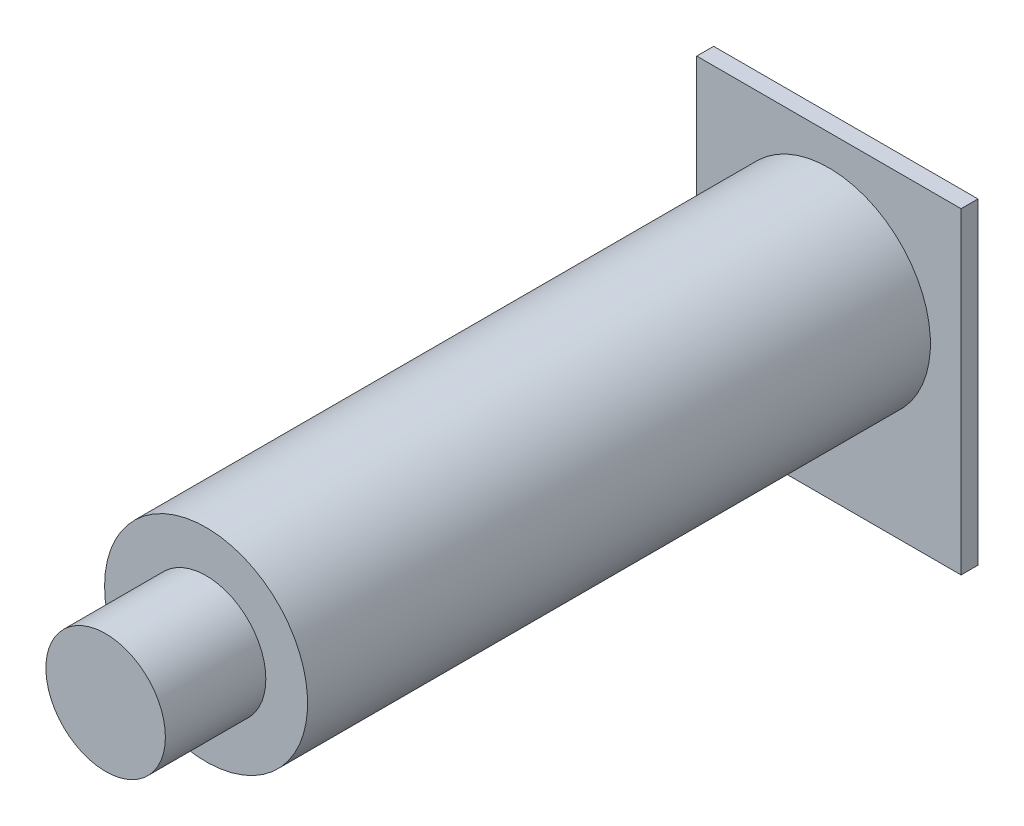
ISO-10303-21;
HEADER;
FILE_DESCRIPTION(('STEP AP214'),'2;1');
FILE_NAME('part.step','',(''),(''),'','','');
FILE_SCHEMA(('AUTOMOTIVE_DESIGN { 1 0 10303 214 1 1 1 1 }'));
ENDSEC;
DATA;
#1=APPLICATION_CONTEXT('core data for automotive mechanical design processes');
#2=APPLICATION_PROTOCOL_DEFINITION('international standard','automotive_design',2000,#1);
#3=PRODUCT_CONTEXT('',#1,'mechanical');
#4=PRODUCT('Part','Part','',(#3));
#5=PRODUCT_RELATED_PRODUCT_CATEGORY('part','',(#4));
#6=PRODUCT_DEFINITION_FORMATION('','',#4);
#7=PRODUCT_DEFINITION_CONTEXT('part definition',#1,'design');
#8=PRODUCT_DEFINITION('design','',#6,#7);
#9=PRODUCT_DEFINITION_SHAPE('','',#8);
#10=(LENGTH_UNIT() NAMED_UNIT(*) SI_UNIT(.MILLI.,.METRE.));
#11=(NAMED_UNIT(*) PLANE_ANGLE_UNIT() SI_UNIT($,.RADIAN.));
#12=(NAMED_UNIT(*) SI_UNIT($,.STERADIAN.) SOLID_ANGLE_UNIT());
#13=UNCERTAINTY_MEASURE_WITH_UNIT(LENGTH_MEASURE(1.E-05),#10,'distance_accuracy_value','');
#14=(GEOMETRIC_REPRESENTATION_CONTEXT(3) GLOBAL_UNCERTAINTY_ASSIGNED_CONTEXT((#13)) GLOBAL_UNIT_ASSIGNED_CONTEXT((#10,
#11,#12)) REPRESENTATION_CONTEXT('',''));
#15=CARTESIAN_POINT('',(0.,0.,0.));
#16=DIRECTION('',(0.,0.,1.));
#17=DIRECTION('',(1.,0.,0.));
#18=AXIS2_PLACEMENT_3D('',#15,#16,#17);
#19=CARTESIAN_POINT('',(-27.2658460090952,34.3642857142857,1.6));
#20=DIRECTION('',(1.,0.,0.));
#21=DIRECTION('',(0.,1.,0.));
#22=AXIS2_PLACEMENT_3D('',#19,#20,#21);
#23=PLANE('',#22);
#24=DIRECTION('',(0.,-1.,0.));
#25=VECTOR('',#24,1.);
#26=CARTESIAN_POINT('',(-27.2658460090952,34.3642857142857,0.));
#27=LINE('',#26,#25);
#28=CARTESIAN_POINT('',(-27.2658460090952,34.3642857142857,0.));
#29=VERTEX_POINT('',#28);
#30=CARTESIAN_POINT('',(-27.2658460090951,4.36428571428572,0.));
#31=VERTEX_POINT('',#30);
#32=EDGE_CURVE('E96',#29,#31,#27,.T.);
#33=ORIENTED_EDGE('',*,*,#32,.T.);
#34=DIRECTION('',(0.,0.,-1.));
#35=VECTOR('',#34,1.);
#36=CARTESIAN_POINT('',(-27.2658460090951,4.36428571428572,1.6));
#37=LINE('',#36,#35);
#38=CARTESIAN_POINT('',(-27.2658460090951,4.36428571428572,1.6));
#39=VERTEX_POINT('',#38);
#40=EDGE_CURVE('E11',#39,#31,#37,.T.);
#41=ORIENTED_EDGE('',*,*,#40,.F.);
#42=DIRECTION('',(0.,-1.,0.));
#43=VECTOR('',#42,1.);
#44=CARTESIAN_POINT('',(-27.2658460090952,34.3642857142857,1.6));
#45=LINE('',#44,#43);
#46=CARTESIAN_POINT('',(-27.2658460090952,34.3642857142857,1.6));
#47=VERTEX_POINT('',#46);
#48=EDGE_CURVE('E84',#47,#39,#45,.T.);
#49=ORIENTED_EDGE('',*,*,#48,.F.);
#50=DIRECTION('',(0.,0.,-1.));
#51=VECTOR('',#50,1.);
#52=CARTESIAN_POINT('',(-27.2658460090952,34.3642857142857,1.6));
#53=LINE('',#52,#51);
#54=EDGE_CURVE('E92',#47,#29,#53,.T.);
#55=ORIENTED_EDGE('',*,*,#54,.T.);
#56=EDGE_LOOP('',(#33,#41,#49,#55));
#57=FACE_BOUND('',#56,.T.);
#58=ADVANCED_FACE('F33',(#57),#23,.F.);
#59=CARTESIAN_POINT('',(-27.2658460090951,4.36428571428572,1.6));
#60=DIRECTION('',(0.,1.,0.));
#61=DIRECTION('',(0.,0.,1.));
#62=AXIS2_PLACEMENT_3D('',#59,#60,#61);
#63=PLANE('',#62);
#64=DIRECTION('',(1.,0.,0.));
#65=VECTOR('',#64,1.);
#66=CARTESIAN_POINT('',(-27.2658460090951,4.36428571428572,0.));
#67=LINE('',#66,#65);
#68=CARTESIAN_POINT('',(-2.26584600909515,4.36428571428572,0.));
#69=VERTEX_POINT('',#68);
#70=EDGE_CURVE('E88',#31,#69,#67,.T.);
#71=ORIENTED_EDGE('',*,*,#70,.T.);
#72=DIRECTION('',(0.,0.,-1.));
#73=VECTOR('',#72,1.);
#74=CARTESIAN_POINT('',(-2.26584600909515,4.36428571428572,1.6));
#75=LINE('',#74,#73);
#76=CARTESIAN_POINT('',(-2.26584600909515,4.36428571428572,1.6));
#77=VERTEX_POINT('',#76);
#78=EDGE_CURVE('E41',#77,#69,#75,.T.);
#79=ORIENTED_EDGE('',*,*,#78,.F.);
#80=DIRECTION('',(1.,0.,0.));
#81=VECTOR('',#80,1.);
#82=CARTESIAN_POINT('',(-27.2658460090951,4.36428571428572,1.6));
#83=LINE('',#82,#81);
#84=EDGE_CURVE('E79',#39,#77,#83,.T.);
#85=ORIENTED_EDGE('',*,*,#84,.F.);
#86=ORIENTED_EDGE('',*,*,#40,.T.);
#87=EDGE_LOOP('',(#71,#79,#85,#86));
#88=FACE_BOUND('',#87,.T.);
#89=ADVANCED_FACE('F87',(#88),#63,.F.);
#90=CARTESIAN_POINT('',(-2.26584600909516,34.3642857142857,1.6));
#91=DIRECTION('',(-1.,0.,0.));
#92=DIRECTION('',(0.,-1.,0.));
#93=AXIS2_PLACEMENT_3D('',#90,#91,#92);
#94=PLANE('',#93);
#95=DIRECTION('',(0.,1.,0.));
#96=VECTOR('',#95,1.);
#97=CARTESIAN_POINT('',(-2.26584600909516,34.3642857142857,0.));
#98=LINE('',#97,#96);
#99=CARTESIAN_POINT('',(-2.26584600909516,34.3642857142857,0.));
#100=VERTEX_POINT('',#99);
#101=EDGE_CURVE('E66',#69,#100,#98,.T.);
#102=ORIENTED_EDGE('',*,*,#101,.T.);
#103=DIRECTION('',(0.,0.,-1.));
#104=VECTOR('',#103,1.);
#105=CARTESIAN_POINT('',(-2.26584600909516,34.3642857142857,1.6));
#106=LINE('',#105,#104);
#107=CARTESIAN_POINT('',(-2.26584600909516,34.3642857142857,1.6));
#108=VERTEX_POINT('',#107);
#109=EDGE_CURVE('E89',#108,#100,#106,.T.);
#110=ORIENTED_EDGE('',*,*,#109,.F.);
#111=DIRECTION('',(0.,1.,0.));
#112=VECTOR('',#111,1.);
#113=CARTESIAN_POINT('',(-2.26584600909516,34.3642857142857,1.6));
#114=LINE('',#113,#112);
#115=EDGE_CURVE('E82',#77,#108,#114,.T.);
#116=ORIENTED_EDGE('',*,*,#115,.F.);
#117=ORIENTED_EDGE('',*,*,#78,.T.);
#118=EDGE_LOOP('',(#102,#110,#116,#117));
#119=FACE_BOUND('',#118,.T.);
#120=ADVANCED_FACE('F90',(#119),#94,.F.);
#121=CARTESIAN_POINT('',(-27.2658460090952,34.3642857142857,1.6));
#122=DIRECTION('',(0.,-1.,0.));
#123=DIRECTION('',(0.,0.,-1.));
#124=AXIS2_PLACEMENT_3D('',#121,#122,#123);
#125=PLANE('',#124);
#126=DIRECTION('',(-1.,0.,0.));
#127=VECTOR('',#126,1.);
#128=CARTESIAN_POINT('',(-27.2658460090952,34.3642857142857,0.));
#129=LINE('',#128,#127);
#130=EDGE_CURVE('E72',#100,#29,#129,.T.);
#131=ORIENTED_EDGE('',*,*,#130,.T.);
#132=ORIENTED_EDGE('',*,*,#54,.F.);
#133=DIRECTION('',(-1.,0.,0.));
#134=VECTOR('',#133,1.);
#135=CARTESIAN_POINT('',(-27.2658460090952,34.3642857142857,1.6));
#136=LINE('',#135,#134);
#137=EDGE_CURVE('E49',#108,#47,#136,.T.);
#138=ORIENTED_EDGE('',*,*,#137,.F.);
#139=ORIENTED_EDGE('',*,*,#109,.T.);
#140=EDGE_LOOP('',(#131,#132,#138,#139));
#141=FACE_BOUND('',#140,.T.);
#142=ADVANCED_FACE('F104',(#141),#125,.F.);
#143=CARTESIAN_POINT('',(0.,0.,1.6));
#144=DIRECTION('',(0.,0.,1.));
#145=DIRECTION('',(1.,0.,0.));
#146=AXIS2_PLACEMENT_3D('',#143,#144,#145);
#147=PLANE('',#146);
#148=CARTESIAN_POINT('',(-14.7658460090951,21.8642857142857,1.6));
#149=DIRECTION('',(0.,0.,1.));
#150=DIRECTION('',(1.,0.,0.));
#151=AXIS2_PLACEMENT_3D('',#148,#149,#150);
#152=CIRCLE('',#151,9.6);
#153=CARTESIAN_POINT('',(-24.3658460090951,21.8642857142857,1.6));
#154=VERTEX_POINT('',#153);
#155=EDGE_CURVE('E110',#154,#154,#152,.T.);
#156=ORIENTED_EDGE('',*,*,#155,.F.);
#157=EDGE_LOOP('',(#156));
#158=FACE_BOUND('',#157,.T.);
#159=ORIENTED_EDGE('',*,*,#48,.T.);
#160=ORIENTED_EDGE('',*,*,#84,.T.);
#161=ORIENTED_EDGE('',*,*,#115,.T.);
#162=ORIENTED_EDGE('',*,*,#137,.T.);
#163=EDGE_LOOP('',(#159,#160,#161,#162));
#164=FACE_BOUND('',#163,.T.);
#165=ADVANCED_FACE('F80',(#158,#164),#147,.T.);
#166=CARTESIAN_POINT('',(0.,0.,0.));
#167=DIRECTION('',(0.,0.,1.));
#168=DIRECTION('',(1.,0.,0.));
#169=AXIS2_PLACEMENT_3D('',#166,#167,#168);
#170=PLANE('',#169);
#171=ORIENTED_EDGE('',*,*,#32,.F.);
#172=ORIENTED_EDGE('',*,*,#130,.F.);
#173=ORIENTED_EDGE('',*,*,#101,.F.);
#174=ORIENTED_EDGE('',*,*,#70,.F.);
#175=EDGE_LOOP('',(#171,#172,#173,#174));
#176=FACE_BOUND('',#175,.T.);
#177=ADVANCED_FACE('F107',(#176),#170,.F.);
#178=CARTESIAN_POINT('',(-14.7658460090951,21.8642857142857,60.5));
#179=DIRECTION('',(0.,0.,-1.));
#180=DIRECTION('',(-1.,0.,0.));
#181=AXIS2_PLACEMENT_3D('',#178,#179,#180);
#182=CYLINDRICAL_SURFACE('',#181,9.6);
#183=CARTESIAN_POINT('',(-14.7658460090951,21.8642857142857,60.5));
#184=DIRECTION('',(0.,0.,1.));
#185=DIRECTION('',(1.,0.,0.));
#186=AXIS2_PLACEMENT_3D('',#183,#184,#185);
#187=CIRCLE('',#186,9.6);
#188=CARTESIAN_POINT('',(-24.3658460090951,21.8642857142857,60.5));
#189=VERTEX_POINT('',#188);
#190=EDGE_CURVE('E99',#189,#189,#187,.T.);
#191=CARTESIAN_POINT('',(-24.3658460090951,21.8642857142857,60.5));
#192=CARTESIAN_POINT('',(-24.3658460090951,21.8642857142857,59.8864583333333));
#193=CARTESIAN_POINT('',(-24.3658460090951,21.8642857142857,59.2729166666667));
#194=CARTESIAN_POINT('',(-24.3658460090951,21.8642857142857,58.0458333333333));
#195=CARTESIAN_POINT('',(-24.3658460090951,21.8642857142857,57.4322916666667));
#196=CARTESIAN_POINT('',(-24.3658460090951,21.8642857142857,56.2052083333333));
#197=CARTESIAN_POINT('',(-24.3658460090951,21.8642857142857,55.5916666666667));
#198=CARTESIAN_POINT('',(-24.3658460090951,21.8642857142857,54.3645833333333));
#199=CARTESIAN_POINT('',(-24.3658460090951,21.8642857142857,53.7510416666667));
#200=CARTESIAN_POINT('',(-24.3658460090951,21.8642857142857,52.5239583333333));
#201=CARTESIAN_POINT('',(-24.3658460090951,21.8642857142857,51.9104166666667));
#202=CARTESIAN_POINT('',(-24.3658460090951,21.8642857142857,50.6833333333333));
#203=CARTESIAN_POINT('',(-24.3658460090951,21.8642857142857,50.0697916666667));
#204=CARTESIAN_POINT('',(-24.3658460090951,21.8642857142857,48.8427083333333));
#205=CARTESIAN_POINT('',(-24.3658460090951,21.8642857142857,48.2291666666667));
#206=CARTESIAN_POINT('',(-24.3658460090951,21.8642857142857,47.0020833333333));
#207=CARTESIAN_POINT('',(-24.3658460090951,21.8642857142857,46.3885416666667));
#208=CARTESIAN_POINT('',(-24.3658460090951,21.8642857142857,45.1614583333333));
#209=CARTESIAN_POINT('',(-24.3658460090951,21.8642857142857,44.5479166666667));
#210=CARTESIAN_POINT('',(-24.3658460090951,21.8642857142857,43.3208333333333));
#211=CARTESIAN_POINT('',(-24.3658460090951,21.8642857142857,42.7072916666667));
#212=CARTESIAN_POINT('',(-24.3658460090951,21.8642857142857,41.4802083333333));
#213=CARTESIAN_POINT('',(-24.3658460090951,21.8642857142857,40.8666666666667));
#214=CARTESIAN_POINT('',(-24.3658460090951,21.8642857142857,39.6395833333333));
#215=CARTESIAN_POINT('',(-24.3658460090951,21.8642857142857,39.0260416666667));
#216=CARTESIAN_POINT('',(-24.3658460090951,21.8642857142857,37.7989583333333));
#217=CARTESIAN_POINT('',(-24.3658460090951,21.8642857142857,37.1854166666667));
#218=CARTESIAN_POINT('',(-24.3658460090951,21.8642857142857,35.9583333333333));
#219=CARTESIAN_POINT('',(-24.3658460090951,21.8642857142857,35.3447916666667));
#220=CARTESIAN_POINT('',(-24.3658460090951,21.8642857142857,34.1177083333333));
#221=CARTESIAN_POINT('',(-24.3658460090951,21.8642857142857,33.5041666666667));
#222=CARTESIAN_POINT('',(-24.3658460090951,21.8642857142857,32.2770833333333));
#223=CARTESIAN_POINT('',(-24.3658460090951,21.8642857142857,31.6635416666667));
#224=CARTESIAN_POINT('',(-24.3658460090951,21.8642857142857,30.4364583333333));
#225=CARTESIAN_POINT('',(-24.3658460090951,21.8642857142857,29.8229166666667));
#226=CARTESIAN_POINT('',(-24.3658460090951,21.8642857142857,28.5958333333333));
#227=CARTESIAN_POINT('',(-24.3658460090951,21.8642857142857,27.9822916666667));
#228=CARTESIAN_POINT('',(-24.3658460090951,21.8642857142857,26.7552083333333));
#229=CARTESIAN_POINT('',(-24.3658460090951,21.8642857142857,26.1416666666667));
#230=CARTESIAN_POINT('',(-24.3658460090951,21.8642857142857,24.9145833333333));
#231=CARTESIAN_POINT('',(-24.3658460090951,21.8642857142857,24.3010416666667));
#232=CARTESIAN_POINT('',(-24.3658460090951,21.8642857142857,23.0739583333333));
#233=CARTESIAN_POINT('',(-24.3658460090951,21.8642857142857,22.4604166666667));
#234=CARTESIAN_POINT('',(-24.3658460090951,21.8642857142857,21.2333333333333));
#235=CARTESIAN_POINT('',(-24.3658460090951,21.8642857142857,20.6197916666667));
#236=CARTESIAN_POINT('',(-24.3658460090951,21.8642857142857,19.3927083333333));
#237=CARTESIAN_POINT('',(-24.3658460090951,21.8642857142857,18.7791666666667));
#238=CARTESIAN_POINT('',(-24.3658460090951,21.8642857142857,17.5520833333333));
#239=CARTESIAN_POINT('',(-24.3658460090951,21.8642857142857,16.9385416666667));
#240=CARTESIAN_POINT('',(-24.3658460090951,21.8642857142857,15.7114583333333));
#241=CARTESIAN_POINT('',(-24.3658460090951,21.8642857142857,15.0979166666667));
#242=CARTESIAN_POINT('',(-24.3658460090951,21.8642857142857,13.8708333333333));
#243=CARTESIAN_POINT('',(-24.3658460090951,21.8642857142857,13.2572916666667));
#244=CARTESIAN_POINT('',(-24.3658460090951,21.8642857142857,12.0302083333333));
#245=CARTESIAN_POINT('',(-24.3658460090951,21.8642857142857,11.4166666666667));
#246=CARTESIAN_POINT('',(-24.3658460090951,21.8642857142857,10.1895833333333));
#247=CARTESIAN_POINT('',(-24.3658460090951,21.8642857142857,9.57604166666667));
#248=CARTESIAN_POINT('',(-24.3658460090951,21.8642857142857,8.34895833333333));
#249=CARTESIAN_POINT('',(-24.3658460090951,21.8642857142857,7.73541666666667));
#250=CARTESIAN_POINT('',(-24.3658460090951,21.8642857142857,6.50833333333333));
#251=CARTESIAN_POINT('',(-24.3658460090951,21.8642857142857,5.89479166666666));
#252=CARTESIAN_POINT('',(-24.3658460090951,21.8642857142857,4.66770833333333));
#253=CARTESIAN_POINT('',(-24.3658460090951,21.8642857142857,4.05416666666666));
#254=CARTESIAN_POINT('',(-24.3658460090951,21.8642857142857,2.82708333333333));
#255=CARTESIAN_POINT('',(-24.3658460090951,21.8642857142857,2.21354166666666));
#256=CARTESIAN_POINT('',(-24.3658460090951,21.8642857142857,1.6));
#257=B_SPLINE_CURVE_WITH_KNOTS('',3,(#191,#192,#193,#194,#195,#196,#197,#198,#199,#200,#201,
#202,#203,#204,#205,#206,#207,#208,#209,#210,#211,#212,#213,#214,#215,#216,#217,#218,#219,#220,
#221,#222,#223,#224,#225,#226,#227,#228,#229,#230,#231,#232,#233,#234,#235,#236,#237,#238,#239,
#240,#241,#242,#243,#244,#245,#246,#247,#248,#249,#250,#251,#252,#253,#254,#255,#256),
.UNSPECIFIED.,.F.,.F.,(4,2,2,2,2,2,2,2,2,2,2,2,2,2,2,2,2,2,2,2,2,2,2,2,2,2,2,2,2,2,2,2,4),(0.,
1.84062500000001,3.68125,5.521875,7.3625,9.20312500000001,11.04375,12.884375,14.725,16.565625,
18.40625,20.246875,22.0875,23.928125,25.76875,27.609375,29.45,31.290625,33.13125,34.971875,
36.8125,38.653125,40.49375,42.334375,44.175,46.015625,47.85625,49.696875,51.5375,53.378125,
55.21875,57.059375,58.9),.UNSPECIFIED.);
#258=EDGE_CURVE('BSEAM133',#189,#154,#257,.T.);
#259=ORIENTED_EDGE('',*,*,#190,.F.);
#260=ORIENTED_EDGE('',*,*,#155,.T.);
#261=ORIENTED_EDGE('',*,*,#258,.T.);
#262=ORIENTED_EDGE('',*,*,#258,.F.);
#263=EDGE_LOOP('',(#259,#261,#260,#262));
#264=FACE_BOUND('',#263,.T.);
#265=ADVANCED_FACE('F133',(#264),#182,.T.);
#266=CARTESIAN_POINT('',(-14.7658460090951,21.8642857142857,60.5));
#267=DIRECTION('',(0.,0.,1.));
#268=DIRECTION('',(1.,0.,0.));
#269=AXIS2_PLACEMENT_3D('',#266,#267,#268);
#270=PLANE('',#269);
#271=CARTESIAN_POINT('',(-14.7658460090951,21.8642857142857,60.5));
#272=DIRECTION('',(0.,0.,1.));
#273=DIRECTION('',(1.,0.,0.));
#274=AXIS2_PLACEMENT_3D('',#271,#272,#273);
#275=CIRCLE('',#274,5.65);
#276=CARTESIAN_POINT('',(-9.11584600909515,21.8642857142857,60.5));
#277=VERTEX_POINT('',#276);
#278=EDGE_CURVE('E116',#277,#277,#275,.T.);
#279=ORIENTED_EDGE('',*,*,#278,.F.);
#280=EDGE_LOOP('',(#279));
#281=FACE_BOUND('',#280,.T.);
#282=ORIENTED_EDGE('',*,*,#190,.T.);
#283=EDGE_LOOP('',(#282));
#284=FACE_BOUND('',#283,.T.);
#285=ADVANCED_FACE('F127',(#281,#284),#270,.T.);
#286=CARTESIAN_POINT('',(-14.7658460090951,21.8642857142857,70.));
#287=DIRECTION('',(0.,0.,-1.));
#288=DIRECTION('',(-1.,0.,0.));
#289=AXIS2_PLACEMENT_3D('',#286,#287,#288);
#290=CYLINDRICAL_SURFACE('',#289,5.65);
#291=CARTESIAN_POINT('',(-14.7658460090951,21.8642857142857,70.));
#292=DIRECTION('',(0.,0.,1.));
#293=DIRECTION('',(1.,0.,0.));
#294=AXIS2_PLACEMENT_3D('',#291,#292,#293);
#295=CIRCLE('',#294,5.65);
#296=CARTESIAN_POINT('',(-9.11584600909515,21.8642857142857,70.));
#297=VERTEX_POINT('',#296);
#298=EDGE_CURVE('E113',#297,#297,#295,.T.);
#299=ORIENTED_EDGE('',*,*,#298,.F.);
#300=EDGE_LOOP('',(#299));
#301=FACE_BOUND('',#300,.T.);
#302=ORIENTED_EDGE('',*,*,#278,.T.);
#303=EDGE_LOOP('',(#302));
#304=FACE_BOUND('',#303,.T.);
#305=ADVANCED_FACE('F124',(#301,#304),#290,.T.);
#306=CARTESIAN_POINT('',(-14.7658460090951,21.8642857142857,70.));
#307=DIRECTION('',(0.,0.,1.));
#308=DIRECTION('',(1.,0.,0.));
#309=AXIS2_PLACEMENT_3D('',#306,#307,#308);
#310=PLANE('',#309);
#311=ORIENTED_EDGE('',*,*,#298,.T.);
#312=EDGE_LOOP('',(#311));
#313=FACE_BOUND('',#312,.T.);
#314=ADVANCED_FACE('F122',(#313),#310,.T.);
#315=CLOSED_SHELL('',(#58,#89,#120,#142,#165,#177,#265,#285,#305,#314));
#316=MANIFOLD_SOLID_BREP('B2',#315);
#317=ADVANCED_BREP_SHAPE_REPRESENTATION('',(#18,#316),#14);
#318=SHAPE_DEFINITION_REPRESENTATION(#9,#317);
ENDSEC;
END-ISO-10303-21;
